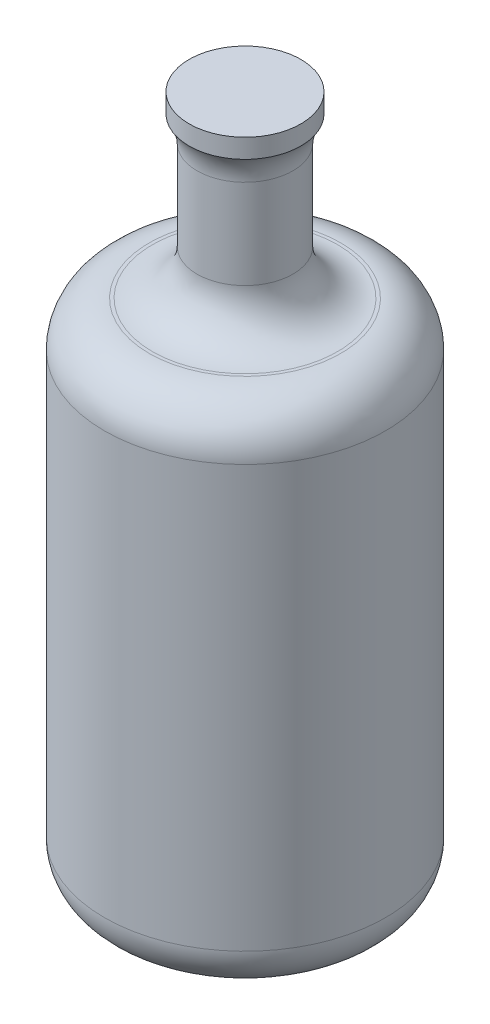
ISO-10303-21;
HEADER;
FILE_DESCRIPTION(('STEP AP214'),'2;1');
FILE_NAME('part.step','',(''),(''),'','','');
FILE_SCHEMA(('AUTOMOTIVE_DESIGN { 1 0 10303 214 1 1 1 1 }'));
ENDSEC;
DATA;
#1=APPLICATION_CONTEXT('core data for automotive mechanical design processes');
#2=APPLICATION_PROTOCOL_DEFINITION('international standard','automotive_design',2000,#1);
#3=PRODUCT_CONTEXT('',#1,'mechanical');
#4=PRODUCT('Part','Part','',(#3));
#5=PRODUCT_RELATED_PRODUCT_CATEGORY('part','',(#4));
#6=PRODUCT_DEFINITION_FORMATION('','',#4);
#7=PRODUCT_DEFINITION_CONTEXT('part definition',#1,'design');
#8=PRODUCT_DEFINITION('design','',#6,#7);
#9=PRODUCT_DEFINITION_SHAPE('','',#8);
#10=(LENGTH_UNIT() NAMED_UNIT(*) SI_UNIT(.MILLI.,.METRE.));
#11=(NAMED_UNIT(*) PLANE_ANGLE_UNIT() SI_UNIT($,.RADIAN.));
#12=(NAMED_UNIT(*) SI_UNIT($,.STERADIAN.) SOLID_ANGLE_UNIT());
#13=UNCERTAINTY_MEASURE_WITH_UNIT(LENGTH_MEASURE(1.E-05),#10,'distance_accuracy_value','');
#14=(GEOMETRIC_REPRESENTATION_CONTEXT(3) GLOBAL_UNCERTAINTY_ASSIGNED_CONTEXT((#13)) GLOBAL_UNIT_ASSIGNED_CONTEXT((#10,
#11,#12)) REPRESENTATION_CONTEXT('',''));
#15=CARTESIAN_POINT('',(0.,0.,0.));
#16=DIRECTION('',(0.,0.,1.));
#17=DIRECTION('',(1.,0.,0.));
#18=AXIS2_PLACEMENT_3D('',#15,#16,#17);
#19=CARTESIAN_POINT('',(0.,160.,0.));
#20=DIRECTION('',(0.,-1.,0.));
#21=DIRECTION('',(0.,0.,-1.));
#22=AXIS2_PLACEMENT_3D('',#19,#20,#21);
#23=CYLINDRICAL_SURFACE('',#22,44.);
#24=CARTESIAN_POINT('',(0.,14.,0.));
#25=DIRECTION('',(0.,1.,0.));
#26=DIRECTION('',(0.,0.,1.));
#27=AXIS2_PLACEMENT_3D('',#24,#25,#26);
#28=CIRCLE('',#27,44.);
#29=CARTESIAN_POINT('',(0.,14.,44.));
#30=VERTEX_POINT('',#29);
#31=EDGE_CURVE('E38',#30,#30,#28,.T.);
#32=ORIENTED_EDGE('',*,*,#31,.T.);
#33=EDGE_LOOP('',(#32));
#34=FACE_BOUND('',#33,.T.);
#35=CARTESIAN_POINT('',(0.,146.,0.));
#36=DIRECTION('',(0.,1.,0.));
#37=DIRECTION('',(0.,0.,1.));
#38=AXIS2_PLACEMENT_3D('',#35,#36,#37);
#39=CIRCLE('',#38,44.);
#40=CARTESIAN_POINT('',(0.,146.,44.));
#41=VERTEX_POINT('',#40);
#42=EDGE_CURVE('E46',#41,#41,#39,.F.);
#43=ORIENTED_EDGE('',*,*,#42,.T.);
#44=EDGE_LOOP('',(#43));
#45=FACE_BOUND('',#44,.T.);
#46=ADVANCED_FACE('F31',(#34,#45),#23,.T.);
#47=CARTESIAN_POINT('',(0.,160.,0.));
#48=DIRECTION('',(0.,1.,0.));
#49=DIRECTION('',(0.,0.,1.));
#50=AXIS2_PLACEMENT_3D('',#47,#48,#49);
#51=PLANE('',#50);
#52=CARTESIAN_POINT('',(0.,160.,0.));
#53=DIRECTION('',(0.,1.,0.));
#54=DIRECTION('',(0.,0.,1.));
#55=AXIS2_PLACEMENT_3D('',#52,#53,#54);
#56=CIRCLE('',#55,29.);
#57=CARTESIAN_POINT('',(0.,160.,29.));
#58=VERTEX_POINT('',#57);
#59=EDGE_CURVE('E51',#58,#58,#56,.F.);
#60=ORIENTED_EDGE('',*,*,#59,.T.);
#61=EDGE_LOOP('',(#60));
#62=FACE_BOUND('',#61,.T.);
#63=CARTESIAN_POINT('',(0.,160.,0.));
#64=DIRECTION('',(0.,1.,0.));
#65=DIRECTION('',(0.,0.,1.));
#66=AXIS2_PLACEMENT_3D('',#63,#64,#65);
#67=CIRCLE('',#66,30.);
#68=CARTESIAN_POINT('',(0.,160.,30.));
#69=VERTEX_POINT('',#68);
#70=EDGE_CURVE('E54',#69,#69,#67,.T.);
#71=ORIENTED_EDGE('',*,*,#70,.T.);
#72=EDGE_LOOP('',(#71));
#73=FACE_BOUND('',#72,.T.);
#74=ADVANCED_FACE('F90',(#62,#73),#51,.T.);
#75=CARTESIAN_POINT('',(0.,0.,0.));
#76=DIRECTION('',(0.,1.,0.));
#77=DIRECTION('',(0.,0.,1.));
#78=AXIS2_PLACEMENT_3D('',#75,#76,#77);
#79=PLANE('',#78);
#80=CARTESIAN_POINT('',(0.,0.,0.));
#81=DIRECTION('',(0.,1.,0.));
#82=DIRECTION('',(0.,0.,1.));
#83=AXIS2_PLACEMENT_3D('',#80,#81,#82);
#84=CIRCLE('',#83,30.);
#85=CARTESIAN_POINT('',(0.,0.,30.));
#86=VERTEX_POINT('',#85);
#87=EDGE_CURVE('E10',#86,#86,#84,.F.);
#88=ORIENTED_EDGE('',*,*,#87,.T.);
#89=EDGE_LOOP('',(#88));
#90=FACE_BOUND('',#89,.T.);
#91=ADVANCED_FACE('F96',(#90),#79,.F.);
#92=CARTESIAN_POINT('',(0.,210.,0.));
#93=DIRECTION('',(0.,-1.,0.));
#94=DIRECTION('',(0.,0.,-1.));
#95=AXIS2_PLACEMENT_3D('',#92,#93,#94);
#96=CYLINDRICAL_SURFACE('',#95,15.);
#97=CARTESIAN_POINT('',(0.,202.015640288664,0.));
#98=DIRECTION('',(0.,1.,0.));
#99=DIRECTION('',(0.,0.,1.));
#100=AXIS2_PLACEMENT_3D('',#97,#98,#99);
#101=CIRCLE('',#100,15.);
#102=CARTESIAN_POINT('',(0.,202.015640288664,15.));
#103=VERTEX_POINT('',#102);
#104=EDGE_CURVE('E42',#103,#103,#101,.F.);
#105=ORIENTED_EDGE('',*,*,#104,.T.);
#106=EDGE_LOOP('',(#105));
#107=FACE_BOUND('',#106,.T.);
#108=CARTESIAN_POINT('',(0.,174.,0.));
#109=DIRECTION('',(0.,1.,0.));
#110=DIRECTION('',(0.,0.,1.));
#111=AXIS2_PLACEMENT_3D('',#108,#109,#110);
#112=CIRCLE('',#111,15.);
#113=CARTESIAN_POINT('',(0.,174.,15.));
#114=VERTEX_POINT('',#113);
#115=EDGE_CURVE('E57',#114,#114,#112,.T.);
#116=ORIENTED_EDGE('',*,*,#115,.T.);
#117=EDGE_LOOP('',(#116));
#118=FACE_BOUND('',#117,.T.);
#119=ADVANCED_FACE('F72',(#107,#118),#96,.T.);
#120=CARTESIAN_POINT('',(0.,216.,0.));
#121=DIRECTION('',(0.,-1.,0.));
#122=DIRECTION('',(0.,0.,-1.));
#123=AXIS2_PLACEMENT_3D('',#120,#121,#122);
#124=CYLINDRICAL_SURFACE('',#123,17.5);
#125=CARTESIAN_POINT('',(0.,216.,0.));
#126=DIRECTION('',(0.,1.,0.));
#127=DIRECTION('',(0.,0.,1.));
#128=AXIS2_PLACEMENT_3D('',#125,#126,#127);
#129=CIRCLE('',#128,17.5);
#130=CARTESIAN_POINT('',(0.,216.,17.5));
#131=VERTEX_POINT('',#130);
#132=EDGE_CURVE('E60',#131,#131,#129,.T.);
#133=ORIENTED_EDGE('',*,*,#132,.F.);
#134=EDGE_LOOP('',(#133));
#135=FACE_BOUND('',#134,.T.);
#136=CARTESIAN_POINT('',(0.,210.,0.));
#137=DIRECTION('',(0.,1.,0.));
#138=DIRECTION('',(0.,0.,1.));
#139=AXIS2_PLACEMENT_3D('',#136,#137,#138);
#140=CIRCLE('',#139,17.5);
#141=CARTESIAN_POINT('',(0.,210.,17.5));
#142=VERTEX_POINT('',#141);
#143=EDGE_CURVE('E61',#142,#142,#140,.T.);
#144=ORIENTED_EDGE('',*,*,#143,.T.);
#145=EDGE_LOOP('',(#144));
#146=FACE_BOUND('',#145,.T.);
#147=ADVANCED_FACE('F69',(#135,#146),#124,.T.);
#148=CARTESIAN_POINT('',(0.,216.,0.));
#149=DIRECTION('',(0.,1.,0.));
#150=DIRECTION('',(0.,0.,1.));
#151=AXIS2_PLACEMENT_3D('',#148,#149,#150);
#152=PLANE('',#151);
#153=ORIENTED_EDGE('',*,*,#132,.T.);
#154=EDGE_LOOP('',(#153));
#155=FACE_BOUND('',#154,.T.);
#156=ADVANCED_FACE('F67',(#155),#152,.T.);
#157=CARTESIAN_POINT('',(0.,174.,0.));
#158=DIRECTION('',(0.,1.,0.));
#159=DIRECTION('',(0.,0.,1.));
#160=AXIS2_PLACEMENT_3D('',#157,#158,#159);
#161=TOROIDAL_SURFACE('',#160,29.,14.);
#162=ORIENTED_EDGE('',*,*,#59,.F.);
#163=EDGE_LOOP('',(#162));
#164=FACE_BOUND('',#163,.T.);
#165=ORIENTED_EDGE('',*,*,#115,.F.);
#166=EDGE_LOOP('',(#165));
#167=FACE_BOUND('',#166,.T.);
#168=ADVANCED_FACE('F85',(#164,#167),#161,.F.);
#169=CARTESIAN_POINT('',(0.,146.,0.));
#170=DIRECTION('',(0.,1.,0.));
#171=DIRECTION('',(0.,0.,1.));
#172=AXIS2_PLACEMENT_3D('',#169,#170,#171);
#173=TOROIDAL_SURFACE('',#172,30.,14.);
#174=ORIENTED_EDGE('',*,*,#42,.F.);
#175=EDGE_LOOP('',(#174));
#176=FACE_BOUND('',#175,.T.);
#177=ORIENTED_EDGE('',*,*,#70,.F.);
#178=EDGE_LOOP('',(#177));
#179=FACE_BOUND('',#178,.T.);
#180=ADVANCED_FACE('F78',(#176,#179),#173,.T.);
#181=CARTESIAN_POINT('',(0.,202.015640288664,0.));
#182=DIRECTION('',(0.,1.,0.));
#183=DIRECTION('',(0.,0.,1.));
#184=AXIS2_PLACEMENT_3D('',#181,#182,#183);
#185=TOROIDAL_SURFACE('',#184,29.,14.);
#186=ORIENTED_EDGE('',*,*,#104,.F.);
#187=EDGE_LOOP('',(#186));
#188=FACE_BOUND('',#187,.T.);
#189=ORIENTED_EDGE('',*,*,#143,.F.);
#190=EDGE_LOOP('',(#189));
#191=FACE_BOUND('',#190,.T.);
#192=ADVANCED_FACE('F76',(#188,#191),#185,.F.);
#193=CARTESIAN_POINT('',(0.,14.,0.));
#194=DIRECTION('',(0.,1.,0.));
#195=DIRECTION('',(0.,0.,1.));
#196=AXIS2_PLACEMENT_3D('',#193,#194,#195);
#197=TOROIDAL_SURFACE('',#196,30.,14.);
#198=ORIENTED_EDGE('',*,*,#87,.F.);
#199=EDGE_LOOP('',(#198));
#200=FACE_BOUND('',#199,.T.);
#201=ORIENTED_EDGE('',*,*,#31,.F.);
#202=EDGE_LOOP('',(#201));
#203=FACE_BOUND('',#202,.T.);
#204=ADVANCED_FACE('F33',(#200,#203),#197,.T.);
#205=CLOSED_SHELL('',(#46,#74,#91,#119,#147,#156,#168,#180,#192,#204));
#206=MANIFOLD_SOLID_BREP('B2',#205);
#207=ADVANCED_BREP_SHAPE_REPRESENTATION('',(#18,#206),#14);
#208=SHAPE_DEFINITION_REPRESENTATION(#9,#207);
ENDSEC;
END-ISO-10303-21;
